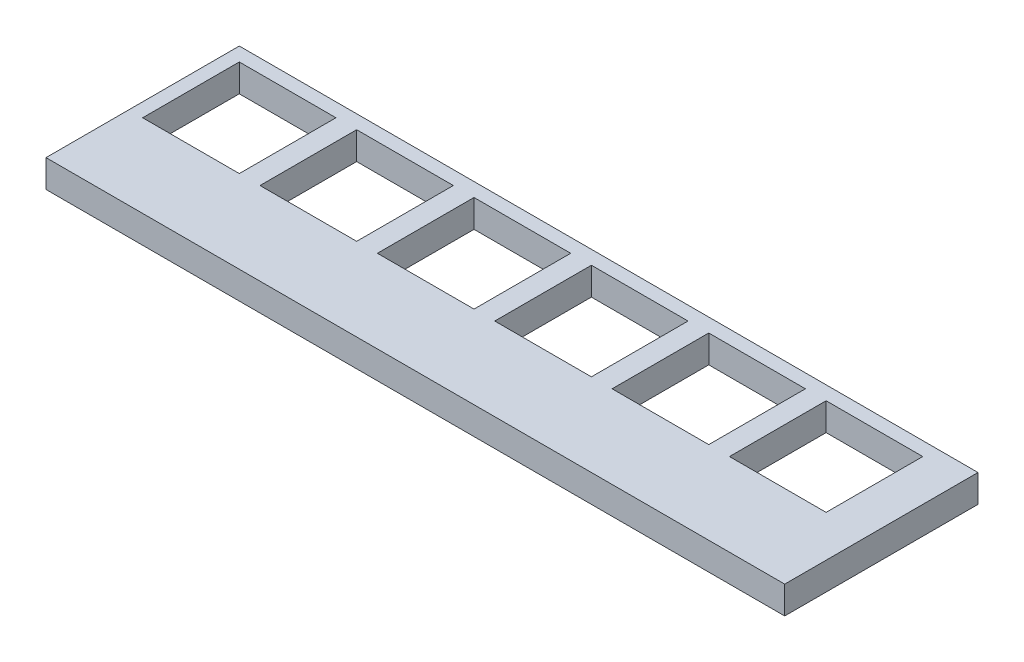
ISO-10303-21;
HEADER;
FILE_DESCRIPTION(('STEP AP214'),'2;1');
FILE_NAME('part.step','',(''),(''),'','','');
FILE_SCHEMA(('AUTOMOTIVE_DESIGN { 1 0 10303 214 1 1 1 1 }'));
ENDSEC;
DATA;
#1=APPLICATION_CONTEXT('core data for automotive mechanical design processes');
#2=APPLICATION_PROTOCOL_DEFINITION('international standard','automotive_design',2000,#1);
#3=PRODUCT_CONTEXT('',#1,'mechanical');
#4=PRODUCT('Part','Part','',(#3));
#5=PRODUCT_RELATED_PRODUCT_CATEGORY('part','',(#4));
#6=PRODUCT_DEFINITION_FORMATION('','',#4);
#7=PRODUCT_DEFINITION_CONTEXT('part definition',#1,'design');
#8=PRODUCT_DEFINITION('design','',#6,#7);
#9=PRODUCT_DEFINITION_SHAPE('','',#8);
#10=(LENGTH_UNIT() NAMED_UNIT(*) SI_UNIT(.MILLI.,.METRE.));
#11=(NAMED_UNIT(*) PLANE_ANGLE_UNIT() SI_UNIT($,.RADIAN.));
#12=(NAMED_UNIT(*) SI_UNIT($,.STERADIAN.) SOLID_ANGLE_UNIT());
#13=UNCERTAINTY_MEASURE_WITH_UNIT(LENGTH_MEASURE(1.E-05),#10,'distance_accuracy_value','');
#14=(GEOMETRIC_REPRESENTATION_CONTEXT(3) GLOBAL_UNCERTAINTY_ASSIGNED_CONTEXT((#13)) GLOBAL_UNIT_ASSIGNED_CONTEXT((#10,
#11,#12)) REPRESENTATION_CONTEXT('',''));
#15=CARTESIAN_POINT('',(0.,0.,0.));
#16=DIRECTION('',(0.,0.,1.));
#17=DIRECTION('',(1.,0.,0.));
#18=AXIS2_PLACEMENT_3D('',#15,#16,#17);
#19=CARTESIAN_POINT('',(0.,4.00000000000046,0.));
#20=DIRECTION('',(0.,1.,0.));
#21=DIRECTION('',(-1.,0.,0.));
#22=AXIS2_PLACEMENT_3D('',#19,#20,#21);
#23=PLANE('',#22);
#24=DIRECTION('',(0.,0.,1.));
#25=VECTOR('',#24,1.);
#26=CARTESIAN_POINT('',(6.56140134695675,4.00000000000042,37.9842071775686));
#27=LINE('',#26,#25);
#28=CARTESIAN_POINT('',(6.56140134695675,4.00000000000076,23.984207177569));
#29=VERTEX_POINT('',#28);
#30=CARTESIAN_POINT('',(6.56140134695675,4.00000000000051,37.9842071775686));
#31=VERTEX_POINT('',#30);
#32=EDGE_CURVE('E266',#29,#31,#27,.T.);
#33=ORIENTED_EDGE('',*,*,#32,.F.);
#34=DIRECTION('',(-1.,0.,0.));
#35=VECTOR('',#34,1.);
#36=CARTESIAN_POINT('',(6.56140134695675,4.00000000000076,23.984207177569));
#37=LINE('',#36,#35);
#38=CARTESIAN_POINT('',(20.5614013469568,4.00000000000088,23.984207177569));
#39=VERTEX_POINT('',#38);
#40=EDGE_CURVE('E243',#39,#29,#37,.T.);
#41=ORIENTED_EDGE('',*,*,#40,.F.);
#42=DIRECTION('',(0.,0.,-1.));
#43=VECTOR('',#42,1.);
#44=CARTESIAN_POINT('',(20.5614013469567,4.0000000000005,37.9842071775686));
#45=LINE('',#44,#43);
#46=CARTESIAN_POINT('',(20.5614013469567,4.0000000000005,37.9842071775686));
#47=VERTEX_POINT('',#46);
#48=EDGE_CURVE('E236',#47,#39,#45,.T.);
#49=ORIENTED_EDGE('',*,*,#48,.F.);
#50=DIRECTION('',(1.,0.,0.));
#51=VECTOR('',#50,1.);
#52=CARTESIAN_POINT('',(6.56140134695675,4.00000000000042,37.9842071775686));
#53=LINE('',#52,#51);
#54=EDGE_CURVE('E225',#31,#47,#53,.T.);
#55=ORIENTED_EDGE('',*,*,#54,.F.);
#56=EDGE_LOOP('',(#33,#41,#49,#55));
#57=FACE_BOUND('',#56,.T.);
#58=DIRECTION('',(-1.,0.,0.));
#59=VECTOR('',#58,1.);
#60=CARTESIAN_POINT('',(-27.4385986530433,4.00000000000021,37.9842071775686));
#61=LINE('',#60,#59);
#62=CARTESIAN_POINT('',(-13.4385986530432,4.00000000000032,37.9842071775686));
#63=VERTEX_POINT('',#62);
#64=CARTESIAN_POINT('',(-27.4385986530433,4.00000000000021,37.9842071775686));
#65=VERTEX_POINT('',#64);
#66=EDGE_CURVE('E328',#63,#65,#61,.T.);
#67=ORIENTED_EDGE('',*,*,#66,.T.);
#68=DIRECTION('',(0.,0.,-1.));
#69=VECTOR('',#68,1.);
#70=CARTESIAN_POINT('',(-27.4385986530432,4.00000000000045,23.984207177569));
#71=LINE('',#70,#69);
#72=CARTESIAN_POINT('',(-27.4385986530432,4.00000000000045,23.984207177569));
#73=VERTEX_POINT('',#72);
#74=EDGE_CURVE('E282',#65,#73,#71,.T.);
#75=ORIENTED_EDGE('',*,*,#74,.T.);
#76=DIRECTION('',(1.,0.,0.));
#77=VECTOR('',#76,1.);
#78=CARTESIAN_POINT('',(-27.4385986530432,4.00000000000045,23.984207177569));
#79=LINE('',#78,#77);
#80=CARTESIAN_POINT('',(-13.4385986530432,4.00000000000034,23.984207177569));
#81=VERTEX_POINT('',#80);
#82=EDGE_CURVE('E340',#73,#81,#79,.T.);
#83=ORIENTED_EDGE('',*,*,#82,.T.);
#84=DIRECTION('',(0.,0.,1.));
#85=VECTOR('',#84,1.);
#86=CARTESIAN_POINT('',(-13.4385986530432,4.00000000000058,23.984207177569));
#87=LINE('',#86,#85);
#88=EDGE_CURVE('E347',#81,#63,#87,.T.);
#89=ORIENTED_EDGE('',*,*,#88,.T.);
#90=EDGE_LOOP('',(#67,#75,#83,#89));
#91=FACE_BOUND('',#90,.T.);
#92=DIRECTION('',(1.,0.,0.));
#93=VECTOR('',#92,1.);
#94=CARTESIAN_POINT('',(-44.4385986530433,4.00000000000011,37.9842071775686));
#95=LINE('',#94,#93);
#96=CARTESIAN_POINT('',(-44.4385986530433,4.00000000000011,37.9842071775686));
#97=VERTEX_POINT('',#96);
#98=CARTESIAN_POINT('',(-30.4385986530432,4.00000000000019,37.9842071775686));
#99=VERTEX_POINT('',#98);
#100=EDGE_CURVE('E339',#97,#99,#95,.T.);
#101=ORIENTED_EDGE('',*,*,#100,.F.);
#102=DIRECTION('',(0.,0.,1.));
#103=VECTOR('',#102,1.);
#104=CARTESIAN_POINT('',(-44.4385986530433,4.00000000000011,37.9842071775686));
#105=LINE('',#104,#103);
#106=CARTESIAN_POINT('',(-44.4385986530432,4.0000000000003,23.984207177569));
#107=VERTEX_POINT('',#106);
#108=EDGE_CURVE('E384',#107,#97,#105,.T.);
#109=ORIENTED_EDGE('',*,*,#108,.F.);
#110=DIRECTION('',(-1.,0.,0.));
#111=VECTOR('',#110,1.);
#112=CARTESIAN_POINT('',(-44.4385986530432,4.0000000000003,23.984207177569));
#113=LINE('',#112,#111);
#114=CARTESIAN_POINT('',(-30.4385986530432,4.00000000000041,23.9842071775689));
#115=VERTEX_POINT('',#114);
#116=EDGE_CURVE('E404',#115,#107,#113,.T.);
#117=ORIENTED_EDGE('',*,*,#116,.F.);
#118=DIRECTION('',(0.,0.,-1.));
#119=VECTOR('',#118,1.);
#120=CARTESIAN_POINT('',(-30.4385986530432,4.00000000000019,37.9842071775686));
#121=LINE('',#120,#119);
#122=EDGE_CURVE('E397',#99,#115,#121,.T.);
#123=ORIENTED_EDGE('',*,*,#122,.F.);
#124=EDGE_LOOP('',(#101,#109,#117,#123));
#125=FACE_BOUND('',#124,.T.);
#126=DIRECTION('',(1.,0.,0.));
#127=VECTOR('',#126,1.);
#128=CARTESIAN_POINT('',(-61.4385986530433,4.00000000000001,37.9842071775686));
#129=LINE('',#128,#127);
#130=CARTESIAN_POINT('',(-61.4385986530433,4.00000000000001,37.9842071775686));
#131=VERTEX_POINT('',#130);
#132=CARTESIAN_POINT('',(-47.4385986530433,4.00000000000005,37.9842071775686));
#133=VERTEX_POINT('',#132);
#134=EDGE_CURVE('E396',#131,#133,#129,.T.);
#135=ORIENTED_EDGE('',*,*,#134,.F.);
#136=DIRECTION('',(0.,0.,1.));
#137=VECTOR('',#136,1.);
#138=CARTESIAN_POINT('',(-61.4385986530433,4.00000000000001,37.9842071775686));
#139=LINE('',#138,#137);
#140=CARTESIAN_POINT('',(-61.4385986530432,4.00000000000017,23.984207177569));
#141=VERTEX_POINT('',#140);
#142=EDGE_CURVE('E440',#141,#131,#139,.T.);
#143=ORIENTED_EDGE('',*,*,#142,.F.);
#144=DIRECTION('',(-1.,0.,0.));
#145=VECTOR('',#144,1.);
#146=CARTESIAN_POINT('',(-61.4385986530432,4.00000000000017,23.984207177569));
#147=LINE('',#146,#145);
#148=CARTESIAN_POINT('',(-47.4385986530432,4.00000000000029,23.984207177569));
#149=VERTEX_POINT('',#148);
#150=EDGE_CURVE('E460',#149,#141,#147,.T.);
#151=ORIENTED_EDGE('',*,*,#150,.F.);
#152=DIRECTION('',(0.,0.,-1.));
#153=VECTOR('',#152,1.);
#154=CARTESIAN_POINT('',(-47.4385986530433,4.00000000000009,37.9842071775686));
#155=LINE('',#154,#153);
#156=EDGE_CURVE('E453',#133,#149,#155,.T.);
#157=ORIENTED_EDGE('',*,*,#156,.F.);
#158=EDGE_LOOP('',(#135,#143,#151,#157));
#159=FACE_BOUND('',#158,.T.);
#160=DIRECTION('',(1.,0.,0.));
#161=VECTOR('',#160,1.);
#162=CARTESIAN_POINT('',(-78.4385986530432,4.,37.9842071775686));
#163=LINE('',#162,#161);
#164=CARTESIAN_POINT('',(-78.4385986530432,4.,37.9842071775686));
#165=VERTEX_POINT('',#164);
#166=CARTESIAN_POINT('',(-64.4385986530433,3.9999999999999,37.9842071775686));
#167=VERTEX_POINT('',#166);
#168=EDGE_CURVE('E452',#165,#167,#163,.T.);
#169=ORIENTED_EDGE('',*,*,#168,.F.);
#170=DIRECTION('',(0.,0.,1.));
#171=VECTOR('',#170,1.);
#172=CARTESIAN_POINT('',(-78.4385986530432,4.,37.9842071775686));
#173=LINE('',#172,#171);
#174=CARTESIAN_POINT('',(-78.4385986530432,4.00000000000002,23.984207177569));
#175=VERTEX_POINT('',#174);
#176=EDGE_CURVE('E496',#175,#165,#173,.T.);
#177=ORIENTED_EDGE('',*,*,#176,.F.);
#178=DIRECTION('',(-1.,0.,0.));
#179=VECTOR('',#178,1.);
#180=CARTESIAN_POINT('',(-78.4385986530432,4.00000000000002,23.984207177569));
#181=LINE('',#180,#179);
#182=CARTESIAN_POINT('',(-64.4385986530432,4.00000000000015,23.984207177569));
#183=VERTEX_POINT('',#182);
#184=EDGE_CURVE('E516',#183,#175,#181,.T.);
#185=ORIENTED_EDGE('',*,*,#184,.F.);
#186=DIRECTION('',(0.,0.,-1.));
#187=VECTOR('',#186,1.);
#188=CARTESIAN_POINT('',(-64.4385986530433,3.99999999999999,37.9842071775686));
#189=LINE('',#188,#187);
#190=EDGE_CURVE('E509',#167,#183,#189,.T.);
#191=ORIENTED_EDGE('',*,*,#190,.F.);
#192=EDGE_LOOP('',(#169,#177,#185,#191));
#193=FACE_BOUND('',#192,.T.);
#194=DIRECTION('',(1.,0.,0.));
#195=VECTOR('',#194,1.);
#196=CARTESIAN_POINT('',(-80.4385986530432,4.,21.9842071775692));
#197=LINE('',#196,#195);
#198=CARTESIAN_POINT('',(-80.4385986530432,4.,21.9842071775692));
#199=VERTEX_POINT('',#198);
#200=CARTESIAN_POINT('',(26.5614013469568,4.00000000000095,21.9842071775692));
#201=VERTEX_POINT('',#200);
#202=EDGE_CURVE('E50',#199,#201,#197,.T.);
#203=ORIENTED_EDGE('',*,*,#202,.F.);
#204=DIRECTION('',(0.,0.,-1.));
#205=VECTOR('',#204,1.);
#206=CARTESIAN_POINT('',(-80.4385986530432,4.,21.9842071775692));
#207=LINE('',#206,#205);
#208=CARTESIAN_POINT('',(-80.4385986530432,3.99999999999998,49.9842071775588));
#209=VERTEX_POINT('',#208);
#210=EDGE_CURVE('E508',#209,#199,#207,.T.);
#211=ORIENTED_EDGE('',*,*,#210,.F.);
#212=DIRECTION('',(-1.,0.,0.));
#213=VECTOR('',#212,1.);
#214=CARTESIAN_POINT('',(-80.4385986530432,3.99999999999998,49.9842071775588));
#215=LINE('',#214,#213);
#216=CARTESIAN_POINT('',(26.5614013469568,4.00000000000093,49.9842071775588));
#217=VERTEX_POINT('',#216);
#218=EDGE_CURVE('E553',#217,#209,#215,.T.);
#219=ORIENTED_EDGE('',*,*,#218,.F.);
#220=DIRECTION('',(0.,0.,1.));
#221=VECTOR('',#220,1.);
#222=CARTESIAN_POINT('',(26.5614013469568,4.00000000000095,21.9842071775692));
#223=LINE('',#222,#221);
#224=EDGE_CURVE('E568',#201,#217,#223,.T.);
#225=ORIENTED_EDGE('',*,*,#224,.F.);
#226=EDGE_LOOP('',(#203,#211,#219,#225));
#227=FACE_BOUND('',#226,.T.);
#228=DIRECTION('',(-1.,0.,0.));
#229=VECTOR('',#228,1.);
#230=CARTESIAN_POINT('',(-10.4385986530433,4.00000000000032,37.9842071775686));
#231=LINE('',#230,#229);
#232=CARTESIAN_POINT('',(3.56140134695675,4.00000000000041,37.9842071775686));
#233=VERTEX_POINT('',#232);
#234=CARTESIAN_POINT('',(-10.4385986530433,4.00000000000032,37.9842071775686));
#235=VERTEX_POINT('',#234);
#236=EDGE_CURVE('E271',#233,#235,#231,.T.);
#237=ORIENTED_EDGE('',*,*,#236,.T.);
#238=DIRECTION('',(0.,0.,-1.));
#239=VECTOR('',#238,1.);
#240=CARTESIAN_POINT('',(-10.4385986530432,4.0000000000006,23.984207177569));
#241=LINE('',#240,#239);
#242=CARTESIAN_POINT('',(-10.4385986530432,4.0000000000006,23.984207177569));
#243=VERTEX_POINT('',#242);
#244=EDGE_CURVE('E297',#235,#243,#241,.T.);
#245=ORIENTED_EDGE('',*,*,#244,.T.);
#246=DIRECTION('',(1.,0.,0.));
#247=VECTOR('',#246,1.);
#248=CARTESIAN_POINT('',(-10.4385986530432,4.0000000000006,23.984207177569));
#249=LINE('',#248,#247);
#250=CARTESIAN_POINT('',(3.56140134695675,4.00000000000049,23.984207177569));
#251=VERTEX_POINT('',#250);
#252=EDGE_CURVE('E283',#243,#251,#249,.T.);
#253=ORIENTED_EDGE('',*,*,#252,.T.);
#254=DIRECTION('',(0.,0.,1.));
#255=VECTOR('',#254,1.);
#256=CARTESIAN_POINT('',(3.56140134695675,4.00000000000072,23.984207177569));
#257=LINE('',#256,#255);
#258=EDGE_CURVE('E290',#251,#233,#257,.T.);
#259=ORIENTED_EDGE('',*,*,#258,.T.);
#260=EDGE_LOOP('',(#237,#245,#253,#259));
#261=FACE_BOUND('',#260,.T.);
#262=ADVANCED_FACE('F42',(#57,#91,#125,#159,#193,#227,#261),#23,.T.);
#263=CARTESIAN_POINT('',(0.,4.5731753324613E-13,0.));
#264=DIRECTION('',(0.,1.,0.));
#265=DIRECTION('',(-1.,0.,0.));
#266=AXIS2_PLACEMENT_3D('',#263,#264,#265);
#267=PLANE('',#266);
#268=DIRECTION('',(-1.,0.,0.));
#269=VECTOR('',#268,1.);
#270=CARTESIAN_POINT('',(6.56140134695675,7.58741681212652E-13,23.984207177569));
#271=LINE('',#270,#269);
#272=CARTESIAN_POINT('',(20.5614013469568,8.79715773839385E-13,23.984207177569));
#273=VERTEX_POINT('',#272);
#274=CARTESIAN_POINT('',(6.56140134695675,7.58741681212652E-13,23.984207177569));
#275=VERTEX_POINT('',#274);
#276=EDGE_CURVE('E244',#273,#275,#271,.T.);
#277=ORIENTED_EDGE('',*,*,#276,.T.);
#278=DIRECTION('',(0.,0.,1.));
#279=VECTOR('',#278,1.);
#280=CARTESIAN_POINT('',(6.56140134695675,4.17670024221407E-13,37.9842071775686));
#281=LINE('',#280,#279);
#282=CARTESIAN_POINT('',(6.56140134695675,4.17670024221407E-13,37.9842071775686));
#283=VERTEX_POINT('',#282);
#284=EDGE_CURVE('E265',#275,#283,#281,.T.);
#285=ORIENTED_EDGE('',*,*,#284,.T.);
#286=DIRECTION('',(1.,0.,0.));
#287=VECTOR('',#286,1.);
#288=CARTESIAN_POINT('',(6.56140134695675,4.17670024221407E-13,37.9842071775686));
#289=LINE('',#288,#287);
#290=CARTESIAN_POINT('',(20.5614013469567,6.35257562415449E-13,37.9842071775686));
#291=VERTEX_POINT('',#290);
#292=EDGE_CURVE('E230',#283,#291,#289,.T.);
#293=ORIENTED_EDGE('',*,*,#292,.T.);
#294=DIRECTION('',(0.,0.,-1.));
#295=VECTOR('',#294,1.);
#296=CARTESIAN_POINT('',(20.5614013469567,4.98002505389117E-13,37.9842071775686));
#297=LINE('',#296,#295);
#298=EDGE_CURVE('E231',#291,#273,#297,.T.);
#299=ORIENTED_EDGE('',*,*,#298,.T.);
#300=EDGE_LOOP('',(#277,#285,#293,#299));
#301=FACE_BOUND('',#300,.T.);
#302=DIRECTION('',(0.,0.,-1.));
#303=VECTOR('',#302,1.);
#304=CARTESIAN_POINT('',(-27.4385986530432,4.54194808850576E-13,23.984207177569));
#305=LINE('',#304,#303);
#306=CARTESIAN_POINT('',(-27.4385986530433,2.1267886229032E-13,37.9842071775686));
#307=VERTEX_POINT('',#306);
#308=CARTESIAN_POINT('',(-27.4385986530432,2.19861682727927E-13,23.984207177569));
#309=VERTEX_POINT('',#308);
#310=EDGE_CURVE('E329',#307,#309,#305,.T.);
#311=ORIENTED_EDGE('',*,*,#310,.F.);
#312=DIRECTION('',(-1.,0.,0.));
#313=VECTOR('',#312,1.);
#314=CARTESIAN_POINT('',(-27.4385986530433,2.12678862290319E-13,37.9842071775686));
#315=LINE('',#314,#313);
#316=CARTESIAN_POINT('',(-13.4385986530432,3.18997597020817E-13,37.9842071775686));
#317=VERTEX_POINT('',#316);
#318=EDGE_CURVE('E364',#317,#307,#315,.T.);
#319=ORIENTED_EDGE('',*,*,#318,.F.);
#320=DIRECTION('',(0.,0.,1.));
#321=VECTOR('',#320,1.);
#322=CARTESIAN_POINT('',(-13.4385986530432,5.76961224597961E-13,23.984207177569));
#323=LINE('',#322,#321);
#324=CARTESIAN_POINT('',(-13.4385986530432,5.76961224597961E-13,23.984207177569));
#325=VERTEX_POINT('',#324);
#326=EDGE_CURVE('E346',#325,#317,#323,.T.);
#327=ORIENTED_EDGE('',*,*,#326,.F.);
#328=DIRECTION('',(1.,0.,0.));
#329=VECTOR('',#328,1.);
#330=CARTESIAN_POINT('',(-27.4385986530432,4.54194808850576E-13,23.984207177569));
#331=LINE('',#330,#329);
#332=EDGE_CURVE('E336',#309,#325,#331,.T.);
#333=ORIENTED_EDGE('',*,*,#332,.F.);
#334=EDGE_LOOP('',(#311,#319,#327,#333));
#335=FACE_BOUND('',#334,.T.);
#336=DIRECTION('',(0.,0.,1.));
#337=VECTOR('',#336,1.);
#338=CARTESIAN_POINT('',(-44.4385986530433,1.10323190491952E-13,37.9842071775686));
#339=LINE('',#338,#337);
#340=CARTESIAN_POINT('',(-44.4385986530432,3.02921472469819E-13,23.984207177569));
#341=VERTEX_POINT('',#340);
#342=CARTESIAN_POINT('',(-44.4385986530433,1.10323190491952E-13,37.9842071775686));
#343=VERTEX_POINT('',#342);
#344=EDGE_CURVE('E419',#341,#343,#339,.T.);
#345=ORIENTED_EDGE('',*,*,#344,.T.);
#346=DIRECTION('',(1.,0.,0.));
#347=VECTOR('',#346,1.);
#348=CARTESIAN_POINT('',(-44.4385986530433,1.10323190491952E-13,37.9842071775686));
#349=LINE('',#348,#347);
#350=CARTESIAN_POINT('',(-30.4385986530432,1.94616096678843E-13,37.9842071775686));
#351=VERTEX_POINT('',#350);
#352=EDGE_CURVE('E385',#343,#351,#349,.T.);
#353=ORIENTED_EDGE('',*,*,#352,.T.);
#354=DIRECTION('',(0.,0.,-1.));
#355=VECTOR('',#354,1.);
#356=CARTESIAN_POINT('',(-30.4385986530432,1.94616096678843E-13,37.9842071775686));
#357=LINE('',#356,#355);
#358=CARTESIAN_POINT('',(-30.4385986530432,1.93899440247457E-13,23.9842071775689));
#359=VERTEX_POINT('',#358);
#360=EDGE_CURVE('E393',#351,#359,#357,.T.);
#361=ORIENTED_EDGE('',*,*,#360,.T.);
#362=DIRECTION('',(-1.,0.,0.));
#363=VECTOR('',#362,1.);
#364=CARTESIAN_POINT('',(-44.4385986530432,3.02921472469819E-13,23.984207177569));
#365=LINE('',#364,#363);
#366=EDGE_CURVE('E403',#359,#341,#365,.T.);
#367=ORIENTED_EDGE('',*,*,#366,.T.);
#368=EDGE_LOOP('',(#345,#353,#361,#367));
#369=FACE_BOUND('',#368,.T.);
#370=DIRECTION('',(0.,0.,1.));
#371=VECTOR('',#370,1.);
#372=CARTESIAN_POINT('',(-61.4385986530433,0.,37.9842071775686));
#373=LINE('',#372,#371);
#374=CARTESIAN_POINT('',(-61.4385986530432,1.68776630738068E-13,23.984207177569));
#375=VERTEX_POINT('',#374);
#376=CARTESIAN_POINT('',(-61.4385986530433,0.,37.9842071775686));
#377=VERTEX_POINT('',#376);
#378=EDGE_CURVE('E475',#375,#377,#373,.T.);
#379=ORIENTED_EDGE('',*,*,#378,.T.);
#380=DIRECTION('',(1.,0.,0.));
#381=VECTOR('',#380,1.);
#382=CARTESIAN_POINT('',(-61.4385986530433,0.,37.9842071775686));
#383=LINE('',#382,#381);
#384=CARTESIAN_POINT('',(-47.4385986530433,0.,37.9842071775686));
#385=VERTEX_POINT('',#384);
#386=EDGE_CURVE('E441',#377,#385,#383,.T.);
#387=ORIENTED_EDGE('',*,*,#386,.T.);
#388=DIRECTION('',(0.,0.,-1.));
#389=VECTOR('',#388,1.);
#390=CARTESIAN_POINT('',(-47.4385986530433,0.,37.9842071775686));
#391=LINE('',#390,#389);
#392=CARTESIAN_POINT('',(-47.4385986530432,0.,23.984207177569));
#393=VERTEX_POINT('',#392);
#394=EDGE_CURVE('E449',#385,#393,#391,.T.);
#395=ORIENTED_EDGE('',*,*,#394,.T.);
#396=DIRECTION('',(-1.,0.,0.));
#397=VECTOR('',#396,1.);
#398=CARTESIAN_POINT('',(-61.4385986530432,1.68776630738068E-13,23.984207177569));
#399=LINE('',#398,#397);
#400=EDGE_CURVE('E459',#393,#375,#399,.T.);
#401=ORIENTED_EDGE('',*,*,#400,.T.);
#402=EDGE_LOOP('',(#379,#387,#395,#401));
#403=FACE_BOUND('',#402,.T.);
#404=DIRECTION('',(0.,0.,1.));
#405=VECTOR('',#404,1.);
#406=CARTESIAN_POINT('',(-78.4385986530432,0.,37.9842071775686));
#407=LINE('',#406,#405);
#408=CARTESIAN_POINT('',(-78.4385986530432,0.,23.984207177569));
#409=VERTEX_POINT('',#408);
#410=CARTESIAN_POINT('',(-78.4385986530432,0.,37.9842071775686));
#411=VERTEX_POINT('',#410);
#412=EDGE_CURVE('E531',#409,#411,#407,.T.);
#413=ORIENTED_EDGE('',*,*,#412,.T.);
#414=DIRECTION('',(1.,0.,0.));
#415=VECTOR('',#414,1.);
#416=CARTESIAN_POINT('',(-78.4385986530432,0.,37.9842071775686));
#417=LINE('',#416,#415);
#418=CARTESIAN_POINT('',(-64.4385986530433,0.,37.9842071775686));
#419=VERTEX_POINT('',#418);
#420=EDGE_CURVE('E497',#411,#419,#417,.T.);
#421=ORIENTED_EDGE('',*,*,#420,.T.);
#422=DIRECTION('',(0.,0.,-1.));
#423=VECTOR('',#422,1.);
#424=CARTESIAN_POINT('',(-64.4385986530433,0.,37.9842071775686));
#425=LINE('',#424,#423);
#426=CARTESIAN_POINT('',(-64.4385986530432,-1.00339307864538E-13,23.984207177569));
#427=VERTEX_POINT('',#426);
#428=EDGE_CURVE('E505',#419,#427,#425,.T.);
#429=ORIENTED_EDGE('',*,*,#428,.T.);
#430=DIRECTION('',(-1.,0.,0.));
#431=VECTOR('',#430,1.);
#432=CARTESIAN_POINT('',(-78.4385986530432,0.,23.984207177569));
#433=LINE('',#432,#431);
#434=EDGE_CURVE('E515',#427,#409,#433,.T.);
#435=ORIENTED_EDGE('',*,*,#434,.T.);
#436=EDGE_LOOP('',(#413,#421,#429,#435));
#437=FACE_BOUND('',#436,.T.);
#438=DIRECTION('',(1.,0.,0.));
#439=VECTOR('',#438,1.);
#440=CARTESIAN_POINT('',(-80.4385986530432,0.,21.9842071775692));
#441=LINE('',#440,#439);
#442=CARTESIAN_POINT('',(-80.4385986530432,0.,21.9842071775692));
#443=VERTEX_POINT('',#442);
#444=CARTESIAN_POINT('',(26.5614013469568,9.54247012833856E-13,21.9842071775692));
#445=VERTEX_POINT('',#444);
#446=EDGE_CURVE('E12',#443,#445,#441,.T.);
#447=ORIENTED_EDGE('',*,*,#446,.T.);
#448=DIRECTION('',(0.,0.,1.));
#449=VECTOR('',#448,1.);
#450=CARTESIAN_POINT('',(26.5614013469568,9.54247012833856E-13,21.9842071775692));
#451=LINE('',#450,#449);
#452=CARTESIAN_POINT('',(26.5614013469568,9.33654210978575E-13,49.9842071775588));
#453=VERTEX_POINT('',#452);
#454=EDGE_CURVE('E567',#445,#453,#451,.T.);
#455=ORIENTED_EDGE('',*,*,#454,.T.);
#456=DIRECTION('',(-1.,0.,0.));
#457=VECTOR('',#456,1.);
#458=CARTESIAN_POINT('',(-80.4385986530432,0.,49.9842071775588));
#459=LINE('',#458,#457);
#460=CARTESIAN_POINT('',(-80.4385986530432,0.,49.9842071775588));
#461=VERTEX_POINT('',#460);
#462=EDGE_CURVE('E582',#453,#461,#459,.T.);
#463=ORIENTED_EDGE('',*,*,#462,.T.);
#464=DIRECTION('',(0.,0.,-1.));
#465=VECTOR('',#464,1.);
#466=CARTESIAN_POINT('',(-80.4385986530432,0.,21.9842071775692));
#467=LINE('',#466,#465);
#468=EDGE_CURVE('E554',#461,#443,#467,.T.);
#469=ORIENTED_EDGE('',*,*,#468,.T.);
#470=EDGE_LOOP('',(#447,#455,#463,#469));
#471=FACE_BOUND('',#470,.T.);
#472=DIRECTION('',(0.,0.,-1.));
#473=VECTOR('',#472,1.);
#474=CARTESIAN_POINT('',(-10.4385986530432,6.0271455765356E-13,23.984207177569));
#475=LINE('',#474,#473);
#476=CARTESIAN_POINT('',(-10.4385986530433,3.15034534088687E-13,37.9842071775686));
#477=VERTEX_POINT('',#476);
#478=CARTESIAN_POINT('',(-10.4385986530432,3.66981056783925E-13,23.984207177569));
#479=VERTEX_POINT('',#478);
#480=EDGE_CURVE('E272',#477,#479,#475,.T.);
#481=ORIENTED_EDGE('',*,*,#480,.F.);
#482=DIRECTION('',(-1.,0.,0.));
#483=VECTOR('',#482,1.);
#484=CARTESIAN_POINT('',(-10.4385986530433,3.15034534088687E-13,37.9842071775686));
#485=LINE('',#484,#483);
#486=CARTESIAN_POINT('',(3.56140134695675,4.06514105009311E-13,37.9842071775686));
#487=VERTEX_POINT('',#486);
#488=EDGE_CURVE('E308',#487,#477,#485,.T.);
#489=ORIENTED_EDGE('',*,*,#488,.F.);
#490=DIRECTION('',(0.,0.,1.));
#491=VECTOR('',#490,1.);
#492=CARTESIAN_POINT('',(3.56140134695675,7.25465442200649E-13,23.984207177569));
#493=LINE('',#492,#491);
#494=CARTESIAN_POINT('',(3.56140134695675,7.25465442200649E-13,23.984207177569));
#495=VERTEX_POINT('',#494);
#496=EDGE_CURVE('E289',#495,#487,#493,.T.);
#497=ORIENTED_EDGE('',*,*,#496,.F.);
#498=DIRECTION('',(1.,0.,0.));
#499=VECTOR('',#498,1.);
#500=CARTESIAN_POINT('',(-10.4385986530432,6.0271455765356E-13,23.984207177569));
#501=LINE('',#500,#499);
#502=EDGE_CURVE('E279',#479,#495,#501,.T.);
#503=ORIENTED_EDGE('',*,*,#502,.F.);
#504=EDGE_LOOP('',(#481,#489,#497,#503));
#505=FACE_BOUND('',#504,.T.);
#506=ADVANCED_FACE('F615',(#301,#335,#369,#403,#437,#471,#505),#267,.F.);
#507=CARTESIAN_POINT('',(-80.4385986530432,0.,21.9842071775692));
#508=DIRECTION('',(1.,0.,0.));
#509=DIRECTION('',(0.,0.,-1.));
#510=AXIS2_PLACEMENT_3D('',#507,#508,#509);
#511=PLANE('',#510);
#512=ORIENTED_EDGE('',*,*,#210,.T.);
#513=DIRECTION('',(0.,1.,0.));
#514=VECTOR('',#513,1.);
#515=CARTESIAN_POINT('',(-80.4385986530432,0.,21.9842071775692));
#516=LINE('',#515,#514);
#517=EDGE_CURVE('E550',#443,#199,#516,.T.);
#518=ORIENTED_EDGE('',*,*,#517,.F.);
#519=ORIENTED_EDGE('',*,*,#468,.F.);
#520=DIRECTION('',(0.,1.,0.));
#521=VECTOR('',#520,1.);
#522=CARTESIAN_POINT('',(-80.4385986530432,0.,49.9842071775588));
#523=LINE('',#522,#521);
#524=EDGE_CURVE('E559',#461,#209,#523,.T.);
#525=ORIENTED_EDGE('',*,*,#524,.T.);
#526=EDGE_LOOP('',(#512,#518,#519,#525));
#527=FACE_BOUND('',#526,.T.);
#528=ADVANCED_FACE('F600',(#527),#511,.F.);
#529=CARTESIAN_POINT('',(-80.4385986530432,0.,49.9842071775588));
#530=DIRECTION('',(0.,0.,-1.));
#531=DIRECTION('',(-1.,0.,0.));
#532=AXIS2_PLACEMENT_3D('',#529,#530,#531);
#533=PLANE('',#532);
#534=ORIENTED_EDGE('',*,*,#218,.T.);
#535=ORIENTED_EDGE('',*,*,#524,.F.);
#536=ORIENTED_EDGE('',*,*,#462,.F.);
#537=DIRECTION('',(0.,1.,0.));
#538=VECTOR('',#537,1.);
#539=CARTESIAN_POINT('',(26.5614013469568,9.33654210978575E-13,49.9842071775588));
#540=LINE('',#539,#538);
#541=EDGE_CURVE('E585',#453,#217,#540,.T.);
#542=ORIENTED_EDGE('',*,*,#541,.T.);
#543=EDGE_LOOP('',(#534,#535,#536,#542));
#544=FACE_BOUND('',#543,.T.);
#545=ADVANCED_FACE('F617',(#544),#533,.F.);
#546=CARTESIAN_POINT('',(26.5614013469568,9.54247012833856E-13,21.9842071775692));
#547=DIRECTION('',(-1.,0.,0.));
#548=DIRECTION('',(0.,0.,1.));
#549=AXIS2_PLACEMENT_3D('',#546,#547,#548);
#550=PLANE('',#549);
#551=ORIENTED_EDGE('',*,*,#224,.T.);
#552=ORIENTED_EDGE('',*,*,#541,.F.);
#553=ORIENTED_EDGE('',*,*,#454,.F.);
#554=DIRECTION('',(0.,1.,0.));
#555=VECTOR('',#554,1.);
#556=CARTESIAN_POINT('',(26.5614013469568,9.54247012833856E-13,21.9842071775692));
#557=LINE('',#556,#555);
#558=EDGE_CURVE('E564',#445,#201,#557,.T.);
#559=ORIENTED_EDGE('',*,*,#558,.T.);
#560=EDGE_LOOP('',(#551,#552,#553,#559));
#561=FACE_BOUND('',#560,.T.);
#562=ADVANCED_FACE('F612',(#561),#550,.F.);
#563=CARTESIAN_POINT('',(-80.4385986530432,0.,21.9842071775692));
#564=DIRECTION('',(0.,0.,1.));
#565=DIRECTION('',(1.,0.,0.));
#566=AXIS2_PLACEMENT_3D('',#563,#564,#565);
#567=PLANE('',#566);
#568=ORIENTED_EDGE('',*,*,#202,.T.);
#569=ORIENTED_EDGE('',*,*,#558,.F.);
#570=ORIENTED_EDGE('',*,*,#446,.F.);
#571=ORIENTED_EDGE('',*,*,#517,.T.);
#572=EDGE_LOOP('',(#568,#569,#570,#571));
#573=FACE_BOUND('',#572,.T.);
#574=ADVANCED_FACE('F610',(#573),#567,.F.);
#575=CARTESIAN_POINT('',(-78.4385986530432,0.,37.9842071775686));
#576=DIRECTION('',(0.,0.,1.));
#577=DIRECTION('',(1.,0.,0.));
#578=AXIS2_PLACEMENT_3D('',#575,#576,#577);
#579=PLANE('',#578);
#580=ORIENTED_EDGE('',*,*,#168,.T.);
#581=DIRECTION('',(0.,1.,0.));
#582=VECTOR('',#581,1.);
#583=CARTESIAN_POINT('',(-64.4385986530433,0.,37.9842071775686));
#584=LINE('',#583,#582);
#585=EDGE_CURVE('E494',#419,#167,#584,.T.);
#586=ORIENTED_EDGE('',*,*,#585,.F.);
#587=ORIENTED_EDGE('',*,*,#420,.F.);
#588=DIRECTION('',(0.,1.,0.));
#589=VECTOR('',#588,1.);
#590=CARTESIAN_POINT('',(-78.4385986530432,0.,37.9842071775686));
#591=LINE('',#590,#589);
#592=EDGE_CURVE('E502',#411,#165,#591,.T.);
#593=ORIENTED_EDGE('',*,*,#592,.T.);
#594=EDGE_LOOP('',(#580,#586,#587,#593));
#595=FACE_BOUND('',#594,.T.);
#596=ADVANCED_FACE('F637',(#595),#579,.F.);
#597=CARTESIAN_POINT('',(-78.4385986530432,0.,37.9842071775686));
#598=DIRECTION('',(-1.,0.,0.));
#599=DIRECTION('',(0.,0.,1.));
#600=AXIS2_PLACEMENT_3D('',#597,#598,#599);
#601=PLANE('',#600);
#602=ORIENTED_EDGE('',*,*,#176,.T.);
#603=ORIENTED_EDGE('',*,*,#592,.F.);
#604=ORIENTED_EDGE('',*,*,#412,.F.);
#605=DIRECTION('',(0.,1.,0.));
#606=VECTOR('',#605,1.);
#607=CARTESIAN_POINT('',(-78.4385986530432,0.,23.984207177569));
#608=LINE('',#607,#606);
#609=EDGE_CURVE('E534',#409,#175,#608,.T.);
#610=ORIENTED_EDGE('',*,*,#609,.T.);
#611=EDGE_LOOP('',(#602,#603,#604,#610));
#612=FACE_BOUND('',#611,.T.);
#613=ADVANCED_FACE('F641',(#612),#601,.F.);
#614=CARTESIAN_POINT('',(-78.4385986530432,0.,23.984207177569));
#615=DIRECTION('',(0.,0.,-1.));
#616=DIRECTION('',(-1.,0.,0.));
#617=AXIS2_PLACEMENT_3D('',#614,#615,#616);
#618=PLANE('',#617);
#619=ORIENTED_EDGE('',*,*,#184,.T.);
#620=ORIENTED_EDGE('',*,*,#609,.F.);
#621=ORIENTED_EDGE('',*,*,#434,.F.);
#622=DIRECTION('',(0.,1.,0.));
#623=VECTOR('',#622,1.);
#624=CARTESIAN_POINT('',(-64.4385986530432,1.46266874195104E-13,23.984207177569));
#625=LINE('',#624,#623);
#626=EDGE_CURVE('E512',#427,#183,#625,.T.);
#627=ORIENTED_EDGE('',*,*,#626,.T.);
#628=EDGE_LOOP('',(#619,#620,#621,#627));
#629=FACE_BOUND('',#628,.T.);
#630=ADVANCED_FACE('F648',(#629),#618,.F.);
#631=CARTESIAN_POINT('',(-64.4385986530433,0.,37.9842071775686));
#632=DIRECTION('',(1.,0.,0.));
#633=DIRECTION('',(0.,0.,-1.));
#634=AXIS2_PLACEMENT_3D('',#631,#632,#633);
#635=PLANE('',#634);
#636=ORIENTED_EDGE('',*,*,#190,.T.);
#637=ORIENTED_EDGE('',*,*,#626,.F.);
#638=ORIENTED_EDGE('',*,*,#428,.F.);
#639=ORIENTED_EDGE('',*,*,#585,.T.);
#640=EDGE_LOOP('',(#636,#637,#638,#639));
#641=FACE_BOUND('',#640,.T.);
#642=ADVANCED_FACE('F626',(#641),#635,.F.);
#643=CARTESIAN_POINT('',(-61.4385986530433,0.,37.9842071775686));
#644=DIRECTION('',(0.,0.,1.));
#645=DIRECTION('',(1.,0.,0.));
#646=AXIS2_PLACEMENT_3D('',#643,#644,#645);
#647=PLANE('',#646);
#648=ORIENTED_EDGE('',*,*,#134,.T.);
#649=DIRECTION('',(0.,1.,0.));
#650=VECTOR('',#649,1.);
#651=CARTESIAN_POINT('',(-47.4385986530433,0.,37.9842071775686));
#652=LINE('',#651,#650);
#653=EDGE_CURVE('E438',#385,#133,#652,.T.);
#654=ORIENTED_EDGE('',*,*,#653,.F.);
#655=ORIENTED_EDGE('',*,*,#386,.F.);
#656=DIRECTION('',(0.,1.,0.));
#657=VECTOR('',#656,1.);
#658=CARTESIAN_POINT('',(-61.4385986530433,0.,37.9842071775686));
#659=LINE('',#658,#657);
#660=EDGE_CURVE('E446',#377,#131,#659,.T.);
#661=ORIENTED_EDGE('',*,*,#660,.T.);
#662=EDGE_LOOP('',(#648,#654,#655,#661));
#663=FACE_BOUND('',#662,.T.);
#664=ADVANCED_FACE('F670',(#663),#647,.F.);
#665=CARTESIAN_POINT('',(-61.4385986530433,0.,37.9842071775686));
#666=DIRECTION('',(-1.,0.,0.));
#667=DIRECTION('',(0.,0.,1.));
#668=AXIS2_PLACEMENT_3D('',#665,#666,#667);
#669=PLANE('',#668);
#670=ORIENTED_EDGE('',*,*,#142,.T.);
#671=ORIENTED_EDGE('',*,*,#660,.F.);
#672=ORIENTED_EDGE('',*,*,#378,.F.);
#673=DIRECTION('',(0.,1.,0.));
#674=VECTOR('',#673,1.);
#675=CARTESIAN_POINT('',(-61.4385986530432,1.68776630738068E-13,23.984207177569));
#676=LINE('',#675,#674);
#677=EDGE_CURVE('E478',#375,#141,#676,.T.);
#678=ORIENTED_EDGE('',*,*,#677,.T.);
#679=EDGE_LOOP('',(#670,#671,#672,#678));
#680=FACE_BOUND('',#679,.T.);
#681=ADVANCED_FACE('F664',(#680),#669,.F.);
#682=CARTESIAN_POINT('',(-61.4385986530432,1.68776630738068E-13,23.984207177569));
#683=DIRECTION('',(0.,0.,-1.));
#684=DIRECTION('',(-1.,0.,0.));
#685=AXIS2_PLACEMENT_3D('',#682,#683,#684);
#686=PLANE('',#685);
#687=ORIENTED_EDGE('',*,*,#150,.T.);
#688=ORIENTED_EDGE('',*,*,#677,.F.);
#689=ORIENTED_EDGE('',*,*,#400,.F.);
#690=DIRECTION('',(0.,1.,0.));
#691=VECTOR('',#690,1.);
#692=CARTESIAN_POINT('',(-47.4385986530432,2.90248480406025E-13,23.984207177569));
#693=LINE('',#692,#691);
#694=EDGE_CURVE('E456',#393,#149,#693,.T.);
#695=ORIENTED_EDGE('',*,*,#694,.T.);
#696=EDGE_LOOP('',(#687,#688,#689,#695));
#697=FACE_BOUND('',#696,.T.);
#698=ADVANCED_FACE('F654',(#697),#686,.F.);
#699=CARTESIAN_POINT('',(-47.4385986530433,0.,37.9842071775686));
#700=DIRECTION('',(1.,0.,0.));
#701=DIRECTION('',(0.,0.,-1.));
#702=AXIS2_PLACEMENT_3D('',#699,#700,#701);
#703=PLANE('',#702);
#704=ORIENTED_EDGE('',*,*,#156,.T.);
#705=ORIENTED_EDGE('',*,*,#694,.F.);
#706=ORIENTED_EDGE('',*,*,#394,.F.);
#707=ORIENTED_EDGE('',*,*,#653,.T.);
#708=EDGE_LOOP('',(#704,#705,#706,#707));
#709=FACE_BOUND('',#708,.T.);
#710=ADVANCED_FACE('F644',(#709),#703,.F.);
#711=CARTESIAN_POINT('',(-44.4385986530433,1.10323190491952E-13,37.9842071775686));
#712=DIRECTION('',(0.,0.,1.));
#713=DIRECTION('',(1.,0.,0.));
#714=AXIS2_PLACEMENT_3D('',#711,#712,#713);
#715=PLANE('',#714);
#716=ORIENTED_EDGE('',*,*,#100,.T.);
#717=DIRECTION('',(0.,1.,0.));
#718=VECTOR('',#717,1.);
#719=CARTESIAN_POINT('',(-30.4385986530432,1.94616096678843E-13,37.9842071775686));
#720=LINE('',#719,#718);
#721=EDGE_CURVE('E382',#351,#99,#720,.T.);
#722=ORIENTED_EDGE('',*,*,#721,.F.);
#723=ORIENTED_EDGE('',*,*,#352,.F.);
#724=DIRECTION('',(0.,1.,0.));
#725=VECTOR('',#724,1.);
#726=CARTESIAN_POINT('',(-44.4385986530433,1.10323190491952E-13,37.9842071775686));
#727=LINE('',#726,#725);
#728=EDGE_CURVE('E390',#343,#97,#727,.T.);
#729=ORIENTED_EDGE('',*,*,#728,.T.);
#730=EDGE_LOOP('',(#716,#722,#723,#729));
#731=FACE_BOUND('',#730,.T.);
#732=ADVANCED_FACE('F653',(#731),#715,.F.);
#733=CARTESIAN_POINT('',(-44.4385986530433,1.10323190491952E-13,37.9842071775686));
#734=DIRECTION('',(-1.,0.,0.));
#735=DIRECTION('',(0.,0.,1.));
#736=AXIS2_PLACEMENT_3D('',#733,#734,#735);
#737=PLANE('',#736);
#738=ORIENTED_EDGE('',*,*,#108,.T.);
#739=ORIENTED_EDGE('',*,*,#728,.F.);
#740=ORIENTED_EDGE('',*,*,#344,.F.);
#741=DIRECTION('',(0.,1.,0.));
#742=VECTOR('',#741,1.);
#743=CARTESIAN_POINT('',(-44.4385986530432,3.02921472469819E-13,23.984207177569));
#744=LINE('',#743,#742);
#745=EDGE_CURVE('E422',#341,#107,#744,.T.);
#746=ORIENTED_EDGE('',*,*,#745,.T.);
#747=EDGE_LOOP('',(#738,#739,#740,#746));
#748=FACE_BOUND('',#747,.T.);
#749=ADVANCED_FACE('F660',(#748),#737,.F.);
#750=CARTESIAN_POINT('',(-44.4385986530432,3.02921472469819E-13,23.984207177569));
#751=DIRECTION('',(0.,0.,-1.));
#752=DIRECTION('',(-1.,0.,0.));
#753=AXIS2_PLACEMENT_3D('',#750,#751,#752);
#754=PLANE('',#753);
#755=ORIENTED_EDGE('',*,*,#116,.T.);
#756=ORIENTED_EDGE('',*,*,#745,.F.);
#757=ORIENTED_EDGE('',*,*,#366,.F.);
#758=DIRECTION('',(0.,1.,0.));
#759=VECTOR('',#758,1.);
#760=CARTESIAN_POINT('',(-30.4385986530432,4.14849553682047E-13,23.9842071775689));
#761=LINE('',#760,#759);
#762=EDGE_CURVE('E400',#359,#115,#761,.T.);
#763=ORIENTED_EDGE('',*,*,#762,.T.);
#764=EDGE_LOOP('',(#755,#756,#757,#763));
#765=FACE_BOUND('',#764,.T.);
#766=ADVANCED_FACE('F679',(#765),#754,.F.);
#767=CARTESIAN_POINT('',(-30.4385986530432,1.94616096678843E-13,37.9842071775686));
#768=DIRECTION('',(1.,0.,0.));
#769=DIRECTION('',(0.,0.,-1.));
#770=AXIS2_PLACEMENT_3D('',#767,#768,#769);
#771=PLANE('',#770);
#772=ORIENTED_EDGE('',*,*,#122,.T.);
#773=ORIENTED_EDGE('',*,*,#762,.F.);
#774=ORIENTED_EDGE('',*,*,#360,.F.);
#775=ORIENTED_EDGE('',*,*,#721,.T.);
#776=EDGE_LOOP('',(#772,#773,#774,#775));
#777=FACE_BOUND('',#776,.T.);
#778=ADVANCED_FACE('F675',(#777),#771,.F.);
#779=CARTESIAN_POINT('',(-27.4385986530432,4.54194808850576E-13,23.984207177569));
#780=DIRECTION('',(1.,0.,0.));
#781=DIRECTION('',(0.,0.,-1.));
#782=AXIS2_PLACEMENT_3D('',#779,#780,#781);
#783=PLANE('',#782);
#784=ORIENTED_EDGE('',*,*,#74,.F.);
#785=DIRECTION('',(0.,1.,0.));
#786=VECTOR('',#785,1.);
#787=CARTESIAN_POINT('',(-27.4385986530433,2.12678862290319E-13,37.9842071775686));
#788=LINE('',#787,#786);
#789=EDGE_CURVE('E333',#307,#65,#788,.T.);
#790=ORIENTED_EDGE('',*,*,#789,.F.);
#791=ORIENTED_EDGE('',*,*,#310,.T.);
#792=DIRECTION('',(0.,1.,0.));
#793=VECTOR('',#792,1.);
#794=CARTESIAN_POINT('',(-27.4385986530432,4.54194808850576E-13,23.984207177569));
#795=LINE('',#794,#793);
#796=EDGE_CURVE('E326',#309,#73,#795,.T.);
#797=ORIENTED_EDGE('',*,*,#796,.T.);
#798=EDGE_LOOP('',(#784,#790,#791,#797));
#799=FACE_BOUND('',#798,.T.);
#800=ADVANCED_FACE('F678',(#799),#783,.T.);
#801=CARTESIAN_POINT('',(-27.4385986530433,2.12678862290319E-13,37.9842071775686));
#802=DIRECTION('',(0.,0.,-1.));
#803=DIRECTION('',(-1.,0.,0.));
#804=AXIS2_PLACEMENT_3D('',#801,#802,#803);
#805=PLANE('',#804);
#806=ORIENTED_EDGE('',*,*,#66,.F.);
#807=DIRECTION('',(0.,1.,0.));
#808=VECTOR('',#807,1.);
#809=CARTESIAN_POINT('',(-13.4385986530432,3.18997597020817E-13,37.9842071775686));
#810=LINE('',#809,#808);
#811=EDGE_CURVE('E367',#317,#63,#810,.T.);
#812=ORIENTED_EDGE('',*,*,#811,.F.);
#813=ORIENTED_EDGE('',*,*,#318,.T.);
#814=ORIENTED_EDGE('',*,*,#789,.T.);
#815=EDGE_LOOP('',(#806,#812,#813,#814));
#816=FACE_BOUND('',#815,.T.);
#817=ADVANCED_FACE('F694',(#816),#805,.T.);
#818=CARTESIAN_POINT('',(-13.4385986530432,5.76961224597961E-13,23.984207177569));
#819=DIRECTION('',(-1.,0.,0.));
#820=DIRECTION('',(0.,0.,1.));
#821=AXIS2_PLACEMENT_3D('',#818,#819,#820);
#822=PLANE('',#821);
#823=ORIENTED_EDGE('',*,*,#88,.F.);
#824=DIRECTION('',(0.,1.,0.));
#825=VECTOR('',#824,1.);
#826=CARTESIAN_POINT('',(-13.4385986530432,5.76961224597961E-13,23.984207177569));
#827=LINE('',#826,#825);
#828=EDGE_CURVE('E343',#325,#81,#827,.T.);
#829=ORIENTED_EDGE('',*,*,#828,.F.);
#830=ORIENTED_EDGE('',*,*,#326,.T.);
#831=ORIENTED_EDGE('',*,*,#811,.T.);
#832=EDGE_LOOP('',(#823,#829,#830,#831));
#833=FACE_BOUND('',#832,.T.);
#834=ADVANCED_FACE('F690',(#833),#822,.T.);
#835=CARTESIAN_POINT('',(-27.4385986530432,4.54194808850576E-13,23.984207177569));
#836=DIRECTION('',(0.,0.,1.));
#837=DIRECTION('',(1.,0.,0.));
#838=AXIS2_PLACEMENT_3D('',#835,#836,#837);
#839=PLANE('',#838);
#840=ORIENTED_EDGE('',*,*,#82,.F.);
#841=ORIENTED_EDGE('',*,*,#796,.F.);
#842=ORIENTED_EDGE('',*,*,#332,.T.);
#843=ORIENTED_EDGE('',*,*,#828,.T.);
#844=EDGE_LOOP('',(#840,#841,#842,#843));
#845=FACE_BOUND('',#844,.T.);
#846=ADVANCED_FACE('F663',(#845),#839,.T.);
#847=CARTESIAN_POINT('',(-10.4385986530432,6.0271455765356E-13,23.984207177569));
#848=DIRECTION('',(1.,0.,0.));
#849=DIRECTION('',(0.,0.,-1.));
#850=AXIS2_PLACEMENT_3D('',#847,#848,#849);
#851=PLANE('',#850);
#852=ORIENTED_EDGE('',*,*,#244,.F.);
#853=DIRECTION('',(0.,1.,0.));
#854=VECTOR('',#853,1.);
#855=CARTESIAN_POINT('',(-10.4385986530433,3.15034534088687E-13,37.9842071775686));
#856=LINE('',#855,#854);
#857=EDGE_CURVE('E276',#477,#235,#856,.T.);
#858=ORIENTED_EDGE('',*,*,#857,.F.);
#859=ORIENTED_EDGE('',*,*,#480,.T.);
#860=DIRECTION('',(0.,1.,0.));
#861=VECTOR('',#860,1.);
#862=CARTESIAN_POINT('',(-10.4385986530432,6.0271455765356E-13,23.984207177569));
#863=LINE('',#862,#861);
#864=EDGE_CURVE('E269',#479,#243,#863,.T.);
#865=ORIENTED_EDGE('',*,*,#864,.T.);
#866=EDGE_LOOP('',(#852,#858,#859,#865));
#867=FACE_BOUND('',#866,.T.);
#868=ADVANCED_FACE('F689',(#867),#851,.T.);
#869=CARTESIAN_POINT('',(-10.4385986530433,3.15034534088687E-13,37.9842071775686));
#870=DIRECTION('',(0.,0.,-1.));
#871=DIRECTION('',(-1.,0.,0.));
#872=AXIS2_PLACEMENT_3D('',#869,#870,#871);
#873=PLANE('',#872);
#874=ORIENTED_EDGE('',*,*,#236,.F.);
#875=DIRECTION('',(0.,1.,0.));
#876=VECTOR('',#875,1.);
#877=CARTESIAN_POINT('',(3.56140134695675,4.06514105009311E-13,37.9842071775686));
#878=LINE('',#877,#876);
#879=EDGE_CURVE('E311',#487,#233,#878,.T.);
#880=ORIENTED_EDGE('',*,*,#879,.F.);
#881=ORIENTED_EDGE('',*,*,#488,.T.);
#882=ORIENTED_EDGE('',*,*,#857,.T.);
#883=EDGE_LOOP('',(#874,#880,#881,#882));
#884=FACE_BOUND('',#883,.T.);
#885=ADVANCED_FACE('F710',(#884),#873,.T.);
#886=CARTESIAN_POINT('',(3.56140134695675,7.25465442200649E-13,23.984207177569));
#887=DIRECTION('',(-1.,0.,0.));
#888=DIRECTION('',(0.,0.,1.));
#889=AXIS2_PLACEMENT_3D('',#886,#887,#888);
#890=PLANE('',#889);
#891=ORIENTED_EDGE('',*,*,#258,.F.);
#892=DIRECTION('',(0.,1.,0.));
#893=VECTOR('',#892,1.);
#894=CARTESIAN_POINT('',(3.56140134695675,7.25465442200649E-13,23.984207177569));
#895=LINE('',#894,#893);
#896=EDGE_CURVE('E286',#495,#251,#895,.T.);
#897=ORIENTED_EDGE('',*,*,#896,.F.);
#898=ORIENTED_EDGE('',*,*,#496,.T.);
#899=ORIENTED_EDGE('',*,*,#879,.T.);
#900=EDGE_LOOP('',(#891,#897,#898,#899));
#901=FACE_BOUND('',#900,.T.);
#902=ADVANCED_FACE('F706',(#901),#890,.T.);
#903=CARTESIAN_POINT('',(-10.4385986530432,6.0271455765356E-13,23.984207177569));
#904=DIRECTION('',(0.,0.,1.));
#905=DIRECTION('',(1.,0.,0.));
#906=AXIS2_PLACEMENT_3D('',#903,#904,#905);
#907=PLANE('',#906);
#908=ORIENTED_EDGE('',*,*,#252,.F.);
#909=ORIENTED_EDGE('',*,*,#864,.F.);
#910=ORIENTED_EDGE('',*,*,#502,.T.);
#911=ORIENTED_EDGE('',*,*,#896,.T.);
#912=EDGE_LOOP('',(#908,#909,#910,#911));
#913=FACE_BOUND('',#912,.T.);
#914=ADVANCED_FACE('F702',(#913),#907,.T.);
#915=CARTESIAN_POINT('',(6.56140134695675,4.17670024221407E-13,37.9842071775686));
#916=DIRECTION('',(-1.,0.,0.));
#917=DIRECTION('',(0.,0.,1.));
#918=AXIS2_PLACEMENT_3D('',#915,#916,#917);
#919=PLANE('',#918);
#920=ORIENTED_EDGE('',*,*,#32,.T.);
#921=DIRECTION('',(0.,1.,0.));
#922=VECTOR('',#921,1.);
#923=CARTESIAN_POINT('',(6.56140134695675,4.17670024221407E-13,37.9842071775686));
#924=LINE('',#923,#922);
#925=EDGE_CURVE('E58',#283,#31,#924,.T.);
#926=ORIENTED_EDGE('',*,*,#925,.F.);
#927=ORIENTED_EDGE('',*,*,#284,.F.);
#928=DIRECTION('',(0.,1.,0.));
#929=VECTOR('',#928,1.);
#930=CARTESIAN_POINT('',(6.56140134695675,7.58741681212652E-13,23.984207177569));
#931=LINE('',#930,#929);
#932=EDGE_CURVE('E262',#275,#29,#931,.T.);
#933=ORIENTED_EDGE('',*,*,#932,.T.);
#934=EDGE_LOOP('',(#920,#926,#927,#933));
#935=FACE_BOUND('',#934,.T.);
#936=ADVANCED_FACE('F705',(#935),#919,.F.);
#937=CARTESIAN_POINT('',(6.56140134695675,7.58741681212652E-13,23.984207177569));
#938=DIRECTION('',(0.,0.,-1.));
#939=DIRECTION('',(-1.,0.,0.));
#940=AXIS2_PLACEMENT_3D('',#937,#938,#939);
#941=PLANE('',#940);
#942=ORIENTED_EDGE('',*,*,#40,.T.);
#943=ORIENTED_EDGE('',*,*,#932,.F.);
#944=ORIENTED_EDGE('',*,*,#276,.F.);
#945=DIRECTION('',(0.,1.,0.));
#946=VECTOR('',#945,1.);
#947=CARTESIAN_POINT('',(20.5614013469568,8.79715773839385E-13,23.984207177569));
#948=LINE('',#947,#946);
#949=EDGE_CURVE('E247',#273,#39,#948,.T.);
#950=ORIENTED_EDGE('',*,*,#949,.T.);
#951=EDGE_LOOP('',(#942,#943,#944,#950));
#952=FACE_BOUND('',#951,.T.);
#953=ADVANCED_FACE('F722',(#952),#941,.F.);
#954=CARTESIAN_POINT('',(20.5614013469567,4.98002505389117E-13,37.9842071775686));
#955=DIRECTION('',(1.,0.,0.));
#956=DIRECTION('',(0.,0.,-1.));
#957=AXIS2_PLACEMENT_3D('',#954,#955,#956);
#958=PLANE('',#957);
#959=ORIENTED_EDGE('',*,*,#48,.T.);
#960=ORIENTED_EDGE('',*,*,#949,.F.);
#961=ORIENTED_EDGE('',*,*,#298,.F.);
#962=DIRECTION('',(0.,1.,0.));
#963=VECTOR('',#962,1.);
#964=CARTESIAN_POINT('',(20.5614013469567,4.98002505389117E-13,37.9842071775686));
#965=LINE('',#964,#963);
#966=EDGE_CURVE('E63',#291,#47,#965,.T.);
#967=ORIENTED_EDGE('',*,*,#966,.T.);
#968=EDGE_LOOP('',(#959,#960,#961,#967));
#969=FACE_BOUND('',#968,.T.);
#970=ADVANCED_FACE('F234',(#969),#958,.F.);
#971=CARTESIAN_POINT('',(6.56140134695675,4.17670024221407E-13,37.9842071775686));
#972=DIRECTION('',(0.,0.,1.));
#973=DIRECTION('',(1.,0.,0.));
#974=AXIS2_PLACEMENT_3D('',#971,#972,#973);
#975=PLANE('',#974);
#976=ORIENTED_EDGE('',*,*,#54,.T.);
#977=ORIENTED_EDGE('',*,*,#966,.F.);
#978=ORIENTED_EDGE('',*,*,#292,.F.);
#979=ORIENTED_EDGE('',*,*,#925,.T.);
#980=EDGE_LOOP('',(#976,#977,#978,#979));
#981=FACE_BOUND('',#980,.T.);
#982=ADVANCED_FACE('F226',(#981),#975,.F.);
#983=CLOSED_SHELL('',(#262,#506,#528,#545,#562,#574,#596,#613,#630,#642,#664,#681,#698,#710,
#732,#749,#766,#778,#800,#817,#834,#846,#868,#885,#902,#914,#936,#953,#970,#982));
#984=MANIFOLD_SOLID_BREP('B2',#983);
#985=ADVANCED_BREP_SHAPE_REPRESENTATION('',(#18,#984),#14);
#986=SHAPE_DEFINITION_REPRESENTATION(#9,#985);
ENDSEC;
END-ISO-10303-21;
